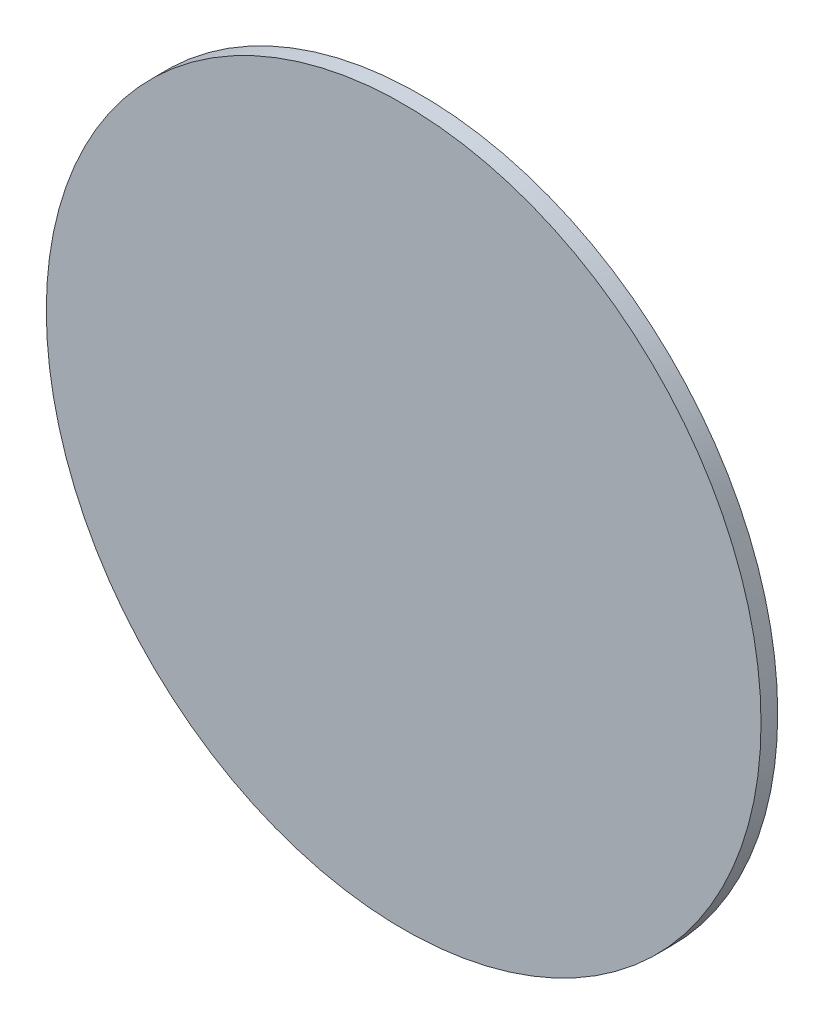
ISO-10303-21;
HEADER;
FILE_DESCRIPTION(('STEP AP214'),'2;1');
FILE_NAME('part.step','',(''),(''),'','','');
FILE_SCHEMA(('AUTOMOTIVE_DESIGN { 1 0 10303 214 1 1 1 1 }'));
ENDSEC;
DATA;
#1=APPLICATION_CONTEXT('core data for automotive mechanical design processes');
#2=APPLICATION_PROTOCOL_DEFINITION('international standard','automotive_design',2000,#1);
#3=PRODUCT_CONTEXT('',#1,'mechanical');
#4=PRODUCT('Part','Part','',(#3));
#5=PRODUCT_RELATED_PRODUCT_CATEGORY('part','',(#4));
#6=PRODUCT_DEFINITION_FORMATION('','',#4);
#7=PRODUCT_DEFINITION_CONTEXT('part definition',#1,'design');
#8=PRODUCT_DEFINITION('design','',#6,#7);
#9=PRODUCT_DEFINITION_SHAPE('','',#8);
#10=(LENGTH_UNIT() NAMED_UNIT(*) SI_UNIT(.MILLI.,.METRE.));
#11=(NAMED_UNIT(*) PLANE_ANGLE_UNIT() SI_UNIT($,.RADIAN.));
#12=(NAMED_UNIT(*) SI_UNIT($,.STERADIAN.) SOLID_ANGLE_UNIT());
#13=UNCERTAINTY_MEASURE_WITH_UNIT(LENGTH_MEASURE(1.E-05),#10,'distance_accuracy_value','');
#14=(GEOMETRIC_REPRESENTATION_CONTEXT(3) GLOBAL_UNCERTAINTY_ASSIGNED_CONTEXT((#13)) GLOBAL_UNIT_ASSIGNED_CONTEXT((#10,
#11,#12)) REPRESENTATION_CONTEXT('',''));
#15=CARTESIAN_POINT('',(0.,0.,0.));
#16=DIRECTION('',(0.,0.,1.));
#17=DIRECTION('',(1.,0.,0.));
#18=AXIS2_PLACEMENT_3D('',#15,#16,#17);
#19=CARTESIAN_POINT('',(0.,0.,5.334));
#20=DIRECTION('',(0.,0.,-1.));
#21=DIRECTION('',(-1.,0.,0.));
#22=AXIS2_PLACEMENT_3D('',#19,#20,#21);
#23=CYLINDRICAL_SURFACE('',#22,114.3);
#24=CARTESIAN_POINT('',(0.,0.,5.334));
#25=DIRECTION('',(0.,0.,1.));
#26=DIRECTION('',(1.,0.,0.));
#27=AXIS2_PLACEMENT_3D('',#24,#25,#26);
#28=CIRCLE('',#27,114.3);
#29=CARTESIAN_POINT('',(114.3,0.,5.334));
#30=VERTEX_POINT('',#29);
#31=EDGE_CURVE('E10',#30,#30,#28,.T.);
#32=ORIENTED_EDGE('',*,*,#31,.F.);
#33=EDGE_LOOP('',(#32));
#34=FACE_BOUND('',#33,.T.);
#35=CARTESIAN_POINT('',(0.,0.,0.));
#36=DIRECTION('',(0.,0.,1.));
#37=DIRECTION('',(1.,0.,0.));
#38=AXIS2_PLACEMENT_3D('',#35,#36,#37);
#39=CIRCLE('',#38,114.3);
#40=CARTESIAN_POINT('',(114.3,0.,0.));
#41=VERTEX_POINT('',#40);
#42=EDGE_CURVE('E36',#41,#41,#39,.T.);
#43=ORIENTED_EDGE('',*,*,#42,.T.);
#44=EDGE_LOOP('',(#43));
#45=FACE_BOUND('',#44,.T.);
#46=ADVANCED_FACE('F33',(#34,#45),#23,.T.);
#47=CARTESIAN_POINT('',(0.,0.,5.334));
#48=DIRECTION('',(0.,0.,1.));
#49=DIRECTION('',(1.,0.,0.));
#50=AXIS2_PLACEMENT_3D('',#47,#48,#49);
#51=PLANE('',#50);
#52=ORIENTED_EDGE('',*,*,#31,.T.);
#53=EDGE_LOOP('',(#52));
#54=FACE_BOUND('',#53,.T.);
#55=ADVANCED_FACE('F48',(#54),#51,.T.);
#56=CARTESIAN_POINT('',(0.,0.,0.));
#57=DIRECTION('',(0.,0.,1.));
#58=DIRECTION('',(1.,0.,0.));
#59=AXIS2_PLACEMENT_3D('',#56,#57,#58);
#60=PLANE('',#59);
#61=ORIENTED_EDGE('',*,*,#42,.F.);
#62=EDGE_LOOP('',(#61));
#63=FACE_BOUND('',#62,.T.);
#64=ADVANCED_FACE('F46',(#63),#60,.F.);
#65=CLOSED_SHELL('',(#46,#55,#64));
#66=MANIFOLD_SOLID_BREP('B2',#65);
#67=ADVANCED_BREP_SHAPE_REPRESENTATION('',(#18,#66),#14);
#68=SHAPE_DEFINITION_REPRESENTATION(#9,#67);
ENDSEC;
END-ISO-10303-21;
